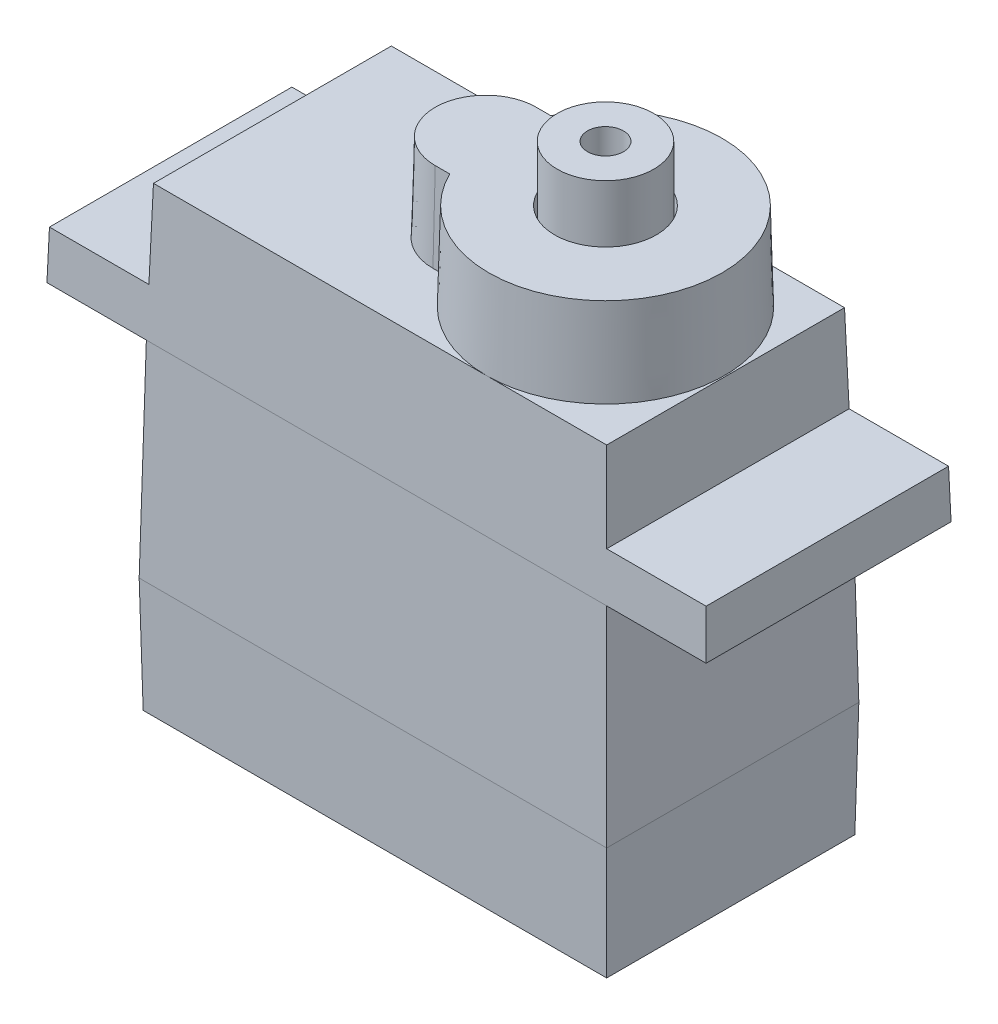
ISO-10303-21;
HEADER;
FILE_DESCRIPTION(('STEP AP214'),'2;1');
FILE_NAME('part.step','',(''),(''),'','','');
FILE_SCHEMA(('AUTOMOTIVE_DESIGN { 1 0 10303 214 1 1 1 1 }'));
ENDSEC;
DATA;
#1=APPLICATION_CONTEXT('core data for automotive mechanical design processes');
#2=APPLICATION_PROTOCOL_DEFINITION('international standard','automotive_design',2000,#1);
#3=PRODUCT_CONTEXT('',#1,'mechanical');
#4=PRODUCT('Part','Part','',(#3));
#5=PRODUCT_RELATED_PRODUCT_CATEGORY('part','',(#4));
#6=PRODUCT_DEFINITION_FORMATION('','',#4);
#7=PRODUCT_DEFINITION_CONTEXT('part definition',#1,'design');
#8=PRODUCT_DEFINITION('design','',#6,#7);
#9=PRODUCT_DEFINITION_SHAPE('','',#8);
#10=(LENGTH_UNIT() NAMED_UNIT(*) SI_UNIT(.MILLI.,.METRE.));
#11=(NAMED_UNIT(*) PLANE_ANGLE_UNIT() SI_UNIT($,.RADIAN.));
#12=(NAMED_UNIT(*) SI_UNIT($,.STERADIAN.) SOLID_ANGLE_UNIT());
#13=UNCERTAINTY_MEASURE_WITH_UNIT(LENGTH_MEASURE(1.E-05),#10,'distance_accuracy_value','');
#14=(GEOMETRIC_REPRESENTATION_CONTEXT(3) GLOBAL_UNCERTAINTY_ASSIGNED_CONTEXT((#13)) GLOBAL_UNIT_ASSIGNED_CONTEXT((#10,
#11,#12)) REPRESENTATION_CONTEXT('',''));
#15=CARTESIAN_POINT('',(0.,0.,0.));
#16=DIRECTION('',(0.,0.,1.));
#17=DIRECTION('',(1.,0.,0.));
#18=AXIS2_PLACEMENT_3D('',#15,#16,#17);
#19=CARTESIAN_POINT('',(0.,11.0236,0.));
#20=DIRECTION('',(0.,1.,0.));
#21=DIRECTION('',(0.,0.,1.));
#22=AXIS2_PLACEMENT_3D('',#19,#20,#21);
#23=PLANE('',#22);
#24=CARTESIAN_POINT('',(5.25,11.0236,0.));
#25=DIRECTION('',(0.,1.,0.));
#26=DIRECTION('',(0.,0.,1.));
#27=AXIS2_PLACEMENT_3D('',#24,#25,#26);
#28=CIRCLE('',#27,2.50825);
#29=CARTESIAN_POINT('',(5.25,11.0236,2.50825));
#30=VERTEX_POINT('',#29);
#31=EDGE_CURVE('E723',#30,#30,#28,.T.);
#32=ORIENTED_EDGE('',*,*,#31,.F.);
#33=EDGE_LOOP('',(#32));
#34=FACE_BOUND('',#33,.T.);
#35=DIRECTION('',(1.,0.,0.));
#36=VECTOR('',#35,1.);
#37=CARTESIAN_POINT('',(-0.652959754470408,11.0236,-2.49009662946031));
#38=LINE('',#37,#36);
#39=CARTESIAN_POINT('',(0.0669441568456282,11.0236,-2.49009662946031));
#40=VERTEX_POINT('',#39);
#41=CARTESIAN_POINT('',(-0.652959754470408,11.0236,-2.49009662946031));
#42=VERTEX_POINT('',#41);
#43=EDGE_CURVE('E179',#40,#42,#38,.F.);
#44=ORIENTED_EDGE('',*,*,#43,.T.);
#45=CARTESIAN_POINT('',(-0.652959754470408,11.0236,0.));
#46=DIRECTION('',(0.,1.,0.));
#47=DIRECTION('',(0.,0.,1.));
#48=AXIS2_PLACEMENT_3D('',#45,#46,#47);
#49=CIRCLE('',#48,2.49009662946031);
#50=CARTESIAN_POINT('',(-0.652959754470408,11.0236,2.49009662946031));
#51=VERTEX_POINT('',#50);
#52=EDGE_CURVE('E185',#42,#51,#49,.T.);
#53=ORIENTED_EDGE('',*,*,#52,.T.);
#54=DIRECTION('',(-1.,0.,0.));
#55=VECTOR('',#54,1.);
#56=CARTESIAN_POINT('',(-0.652959754470408,11.0236,2.49009662946031));
#57=LINE('',#56,#55);
#58=CARTESIAN_POINT('',(0.0669441568456274,11.0236,2.49009662946031));
#59=VERTEX_POINT('',#58);
#60=EDGE_CURVE('E188',#51,#59,#57,.F.);
#61=ORIENTED_EDGE('',*,*,#60,.T.);
#62=CARTESIAN_POINT('',(5.25,11.0236,0.));
#63=DIRECTION('',(0.,1.,0.));
#64=DIRECTION('',(0.,0.,1.));
#65=AXIS2_PLACEMENT_3D('',#62,#63,#64);
#66=CIRCLE('',#65,5.75018687498991);
#67=EDGE_CURVE('E173',#59,#40,#66,.T.);
#68=ORIENTED_EDGE('',*,*,#67,.T.);
#69=EDGE_LOOP('',(#44,#53,#61,#68));
#70=FACE_BOUND('',#69,.T.);
#71=ADVANCED_FACE('F37',(#34,#70),#23,.T.);
#72=CARTESIAN_POINT('',(0.,6.6929,0.));
#73=DIRECTION('',(0.,1.,0.));
#74=DIRECTION('',(0.,0.,1.));
#75=AXIS2_PLACEMENT_3D('',#72,#73,#74);
#76=PLANE('',#75);
#77=CARTESIAN_POINT('',(5.25,6.6929,0.));
#78=DIRECTION('',(0.,1.,0.));
#79=DIRECTION('',(0.,0.,1.));
#80=AXIS2_PLACEMENT_3D('',#77,#78,#79);
#81=CIRCLE('',#80,5.86359024552959);
#82=CARTESIAN_POINT('',(5.25,6.6929,-5.86359024552959));
#83=VERTEX_POINT('',#82);
#84=CARTESIAN_POINT('',(-0.0039012474036702,6.6929,-2.60349999999999));
#85=VERTEX_POINT('',#84);
#86=EDGE_CURVE('E12',#83,#85,#81,.T.);
#87=ORIENTED_EDGE('',*,*,#86,.F.);
#88=DIRECTION('',(1.,0.,0.));
#89=VECTOR('',#88,1.);
#90=CARTESIAN_POINT('',(0.,6.6929,-5.86359024552959));
#91=LINE('',#90,#89);
#92=CARTESIAN_POINT('',(-11.1721902455296,6.6929,-5.86359024552959));
#93=VERTEX_POINT('',#92);
#94=EDGE_CURVE('E443',#83,#93,#91,.F.);
#95=ORIENTED_EDGE('',*,*,#94,.T.);
#96=DIRECTION('',(0.,0.,-1.));
#97=VECTOR('',#96,1.);
#98=CARTESIAN_POINT('',(-11.1721902455296,6.6929,0.));
#99=LINE('',#98,#97);
#100=CARTESIAN_POINT('',(-11.1721902455296,6.6929,5.86359024552959));
#101=VERTEX_POINT('',#100);
#102=EDGE_CURVE('E437',#93,#101,#99,.F.);
#103=ORIENTED_EDGE('',*,*,#102,.T.);
#104=DIRECTION('',(-1.,0.,0.));
#105=VECTOR('',#104,1.);
#106=CARTESIAN_POINT('',(0.,6.6929,5.86359024552959));
#107=LINE('',#106,#105);
#108=CARTESIAN_POINT('',(5.25,6.6929,5.86359024552959));
#109=VERTEX_POINT('',#108);
#110=EDGE_CURVE('E382',#101,#109,#107,.F.);
#111=ORIENTED_EDGE('',*,*,#110,.T.);
#112=CARTESIAN_POINT('',(-0.00390124740367107,6.6929,2.60349999999999));
#113=VERTEX_POINT('',#112);
#114=EDGE_CURVE('E48',#113,#109,#81,.T.);
#115=ORIENTED_EDGE('',*,*,#114,.F.);
#116=DIRECTION('',(1.,0.,0.));
#117=VECTOR('',#116,1.);
#118=CARTESIAN_POINT('',(-0.652959754470408,6.6929,2.60349999999999));
#119=LINE('',#118,#117);
#120=CARTESIAN_POINT('',(-0.652959754470408,6.6929,2.60349999999999));
#121=VERTEX_POINT('',#120);
#122=EDGE_CURVE('E202',#121,#113,#119,.T.);
#123=ORIENTED_EDGE('',*,*,#122,.F.);
#124=CARTESIAN_POINT('',(-0.652959754470408,6.6929,0.));
#125=DIRECTION('',(0.,1.,0.));
#126=DIRECTION('',(0.,0.,1.));
#127=AXIS2_PLACEMENT_3D('',#124,#125,#126);
#128=CIRCLE('',#127,2.60349999999999);
#129=CARTESIAN_POINT('',(-0.652959754470408,6.6929,-2.60349999999999));
#130=VERTEX_POINT('',#129);
#131=EDGE_CURVE('E59',#130,#121,#128,.T.);
#132=ORIENTED_EDGE('',*,*,#131,.F.);
#133=DIRECTION('',(-1.,0.,0.));
#134=VECTOR('',#133,1.);
#135=CARTESIAN_POINT('',(-0.652959754470408,6.6929,-2.60349999999999));
#136=LINE('',#135,#134);
#137=EDGE_CURVE('E55',#85,#130,#136,.T.);
#138=ORIENTED_EDGE('',*,*,#137,.F.);
#139=EDGE_LOOP('',(#87,#95,#103,#111,#115,#123,#132,#138));
#140=FACE_BOUND('',#139,.T.);
#141=ADVANCED_FACE('F252',(#140),#76,.T.);
#142=CARTESIAN_POINT('',(0.,0.,0.));
#143=DIRECTION('',(0.,1.,0.));
#144=DIRECTION('',(0.,0.,1.));
#145=AXIS2_PLACEMENT_3D('',#142,#143,#144);
#146=PLANE('',#145);
#147=DIRECTION('',(0.,0.,1.));
#148=VECTOR('',#147,1.);
#149=CARTESIAN_POINT('',(11.34745,0.,-6.03885));
#150=LINE('',#149,#148);
#151=CARTESIAN_POINT('',(11.34745,0.,-6.03885));
#152=VERTEX_POINT('',#151);
#153=CARTESIAN_POINT('',(11.34745,0.,6.03885));
#154=VERTEX_POINT('',#153);
#155=EDGE_CURVE('E473',#152,#154,#150,.T.);
#156=ORIENTED_EDGE('',*,*,#155,.F.);
#157=DIRECTION('',(1.,0.,0.));
#158=VECTOR('',#157,1.);
#159=CARTESIAN_POINT('',(0.,0.,-6.03885));
#160=LINE('',#159,#158);
#161=CARTESIAN_POINT('',(16.25,0.,-6.03885));
#162=VERTEX_POINT('',#161);
#163=EDGE_CURVE('E367',#162,#152,#160,.F.);
#164=ORIENTED_EDGE('',*,*,#163,.F.);
#165=DIRECTION('',(0.,0.,1.));
#166=VECTOR('',#165,1.);
#167=CARTESIAN_POINT('',(16.25,0.,0.));
#168=LINE('',#167,#166);
#169=CARTESIAN_POINT('',(16.25,0.,6.03885));
#170=VERTEX_POINT('',#169);
#171=EDGE_CURVE('E384',#170,#162,#168,.F.);
#172=ORIENTED_EDGE('',*,*,#171,.F.);
#173=DIRECTION('',(-1.,0.,0.));
#174=VECTOR('',#173,1.);
#175=CARTESIAN_POINT('',(0.,0.,6.03885));
#176=LINE('',#175,#174);
#177=EDGE_CURVE('E347',#154,#170,#176,.F.);
#178=ORIENTED_EDGE('',*,*,#177,.F.);
#179=EDGE_LOOP('',(#156,#164,#172,#178));
#180=FACE_BOUND('',#179,.T.);
#181=ADVANCED_FACE('F258',(#180),#146,.F.);
#182=DIRECTION('',(0.,0.,-1.));
#183=VECTOR('',#182,1.);
#184=CARTESIAN_POINT('',(-11.34745,0.,6.03885));
#185=LINE('',#184,#183);
#186=CARTESIAN_POINT('',(-11.34745,0.,6.03885));
#187=VERTEX_POINT('',#186);
#188=CARTESIAN_POINT('',(-11.34745,0.,-6.03885));
#189=VERTEX_POINT('',#188);
#190=EDGE_CURVE('E394',#187,#189,#185,.T.);
#191=ORIENTED_EDGE('',*,*,#190,.F.);
#192=CARTESIAN_POINT('',(-16.25,0.,6.03885));
#193=VERTEX_POINT('',#192);
#194=EDGE_CURVE('E350',#193,#187,#176,.F.);
#195=ORIENTED_EDGE('',*,*,#194,.F.);
#196=DIRECTION('',(0.,0.,-1.));
#197=VECTOR('',#196,1.);
#198=CARTESIAN_POINT('',(-16.25,0.,0.));
#199=LINE('',#198,#197);
#200=CARTESIAN_POINT('',(-16.25,0.,-6.03885));
#201=VERTEX_POINT('',#200);
#202=EDGE_CURVE('E339',#201,#193,#199,.F.);
#203=ORIENTED_EDGE('',*,*,#202,.F.);
#204=EDGE_CURVE('E378',#189,#201,#160,.F.);
#205=ORIENTED_EDGE('',*,*,#204,.F.);
#206=EDGE_LOOP('',(#191,#195,#203,#205));
#207=FACE_BOUND('',#206,.T.);
#208=ADVANCED_FACE('F312',(#207),#146,.F.);
#209=CARTESIAN_POINT('',(0.,2.3749,0.));
#210=DIRECTION('',(0.,1.,0.));
#211=DIRECTION('',(0.,0.,1.));
#212=AXIS2_PLACEMENT_3D('',#209,#210,#211);
#213=PLANE('',#212);
#214=DIRECTION('',(0.,0.,-1.));
#215=VECTOR('',#214,1.);
#216=CARTESIAN_POINT('',(-11.2852610548653,2.3749,0.));
#217=LINE('',#216,#215);
#218=CARTESIAN_POINT('',(-11.2852610548653,2.3749,-5.97666105486534));
#219=VERTEX_POINT('',#218);
#220=CARTESIAN_POINT('',(-11.2852610548653,2.3749,5.97666105486534));
#221=VERTEX_POINT('',#220);
#222=EDGE_CURVE('E370',#219,#221,#217,.F.);
#223=ORIENTED_EDGE('',*,*,#222,.F.);
#224=DIRECTION('',(1.,0.,0.));
#225=VECTOR('',#224,1.);
#226=CARTESIAN_POINT('',(0.,2.3749,-5.97666105486534));
#227=LINE('',#226,#225);
#228=CARTESIAN_POINT('',(-16.1878110548653,2.3749,-5.97666105486534));
#229=VERTEX_POINT('',#228);
#230=EDGE_CURVE('E359',#219,#229,#227,.F.);
#231=ORIENTED_EDGE('',*,*,#230,.T.);
#232=DIRECTION('',(0.,0.,-1.));
#233=VECTOR('',#232,1.);
#234=CARTESIAN_POINT('',(-16.1878110548653,2.3749,0.));
#235=LINE('',#234,#233);
#236=CARTESIAN_POINT('',(-16.1878110548653,2.3749,5.97666105486534));
#237=VERTEX_POINT('',#236);
#238=EDGE_CURVE('E363',#229,#237,#235,.F.);
#239=ORIENTED_EDGE('',*,*,#238,.T.);
#240=DIRECTION('',(-1.,0.,0.));
#241=VECTOR('',#240,1.);
#242=CARTESIAN_POINT('',(0.,2.3749,5.97666105486534));
#243=LINE('',#242,#241);
#244=EDGE_CURVE('E368',#237,#221,#243,.F.);
#245=ORIENTED_EDGE('',*,*,#244,.T.);
#246=EDGE_LOOP('',(#223,#231,#239,#245));
#247=FACE_BOUND('',#246,.T.);
#248=ADVANCED_FACE('F309',(#247),#213,.T.);
#249=CARTESIAN_POINT('',(-16.25,0.,0.));
#250=DIRECTION('',(-0.999657324975557,0.0261769483078732,0.));
#251=DIRECTION('',(-0.0261769483078732,-0.999657324975557,0.));
#252=AXIS2_PLACEMENT_3D('',#249,#250,#251);
#253=PLANE('',#252);
#254=ORIENTED_EDGE('',*,*,#202,.T.);
#255=DIRECTION('',(-0.0261679842649794,-0.99931500198837,0.0261679842649794));
#256=VECTOR('',#255,1.);
#257=CARTESIAN_POINT('',(-16.238872594742,0.42493846277658,6.027722594742));
#258=LINE('',#257,#256);
#259=EDGE_CURVE('E342',#237,#193,#258,.T.);
#260=ORIENTED_EDGE('',*,*,#259,.F.);
#261=ORIENTED_EDGE('',*,*,#238,.F.);
#262=DIRECTION('',(-0.0261679842649794,-0.99931500198837,-0.0261679842649794));
#263=VECTOR('',#262,1.);
#264=CARTESIAN_POINT('',(-16.2458648165389,0.157916285288514,-6.03471481653894));
#265=LINE('',#264,#263);
#266=EDGE_CURVE('E344',#229,#201,#265,.T.);
#267=ORIENTED_EDGE('',*,*,#266,.T.);
#268=EDGE_LOOP('',(#254,#260,#261,#267));
#269=FACE_BOUND('',#268,.T.);
#270=ADVANCED_FACE('F326',(#269),#253,.T.);
#271=CARTESIAN_POINT('',(0.,0.,6.03885));
#272=DIRECTION('',(0.,0.0261769483078732,0.999657324975557));
#273=DIRECTION('',(0.,-0.999657324975557,0.0261769483078732));
#274=AXIS2_PLACEMENT_3D('',#271,#272,#273);
#275=PLANE('',#274);
#276=ORIENTED_EDGE('',*,*,#194,.T.);
#277=DIRECTION('',(-1.,0.,0.));
#278=VECTOR('',#277,1.);
#279=CARTESIAN_POINT('',(11.34745,0.,6.03885));
#280=LINE('',#279,#278);
#281=EDGE_CURVE('E399',#154,#187,#280,.T.);
#282=ORIENTED_EDGE('',*,*,#281,.F.);
#283=ORIENTED_EDGE('',*,*,#177,.T.);
#284=DIRECTION('',(0.0261679842649794,-0.99931500198837,0.0261679842649794));
#285=VECTOR('',#284,1.);
#286=CARTESIAN_POINT('',(16.2458648165389,0.157916285288514,6.03471481653894));
#287=LINE('',#286,#285);
#288=CARTESIAN_POINT('',(16.1878110548653,2.3749,5.97666105486534));
#289=VERTEX_POINT('',#288);
#290=EDGE_CURVE('E432',#289,#170,#287,.T.);
#291=ORIENTED_EDGE('',*,*,#290,.F.);
#292=DIRECTION('',(-1.,0.,0.));
#293=VECTOR('',#292,1.);
#294=CARTESIAN_POINT('',(0.,2.3749,5.97666105486534));
#295=LINE('',#294,#293);
#296=CARTESIAN_POINT('',(11.2852610548653,2.3749,5.97666105486534));
#297=VERTEX_POINT('',#296);
#298=EDGE_CURVE('E366',#297,#289,#295,.F.);
#299=ORIENTED_EDGE('',*,*,#298,.F.);
#300=DIRECTION('',(0.0261679842649794,-0.99931500198837,0.0261679842649794));
#301=VECTOR('',#300,1.);
#302=CARTESIAN_POINT('',(11.3433148165389,0.157916285288514,6.03471481653894));
#303=LINE('',#302,#301);
#304=CARTESIAN_POINT('',(11.1721902455296,6.6929,5.86359024552959));
#305=VERTEX_POINT('',#304);
#306=EDGE_CURVE('E353',#305,#297,#303,.T.);
#307=ORIENTED_EDGE('',*,*,#306,.F.);
#308=EDGE_CURVE('E446',#109,#305,#107,.F.);
#309=ORIENTED_EDGE('',*,*,#308,.F.);
#310=ORIENTED_EDGE('',*,*,#110,.F.);
#311=DIRECTION('',(-0.0261679842649794,-0.99931500198837,0.0261679842649794));
#312=VECTOR('',#311,1.);
#313=CARTESIAN_POINT('',(-11.3396796815511,0.296736489811329,6.03107968155109));
#314=LINE('',#313,#312);
#315=EDGE_CURVE('E348',#101,#221,#314,.T.);
#316=ORIENTED_EDGE('',*,*,#315,.T.);
#317=ORIENTED_EDGE('',*,*,#244,.F.);
#318=ORIENTED_EDGE('',*,*,#259,.T.);
#319=EDGE_LOOP('',(#276,#282,#283,#291,#299,#307,#309,#310,#316,#317,#318));
#320=FACE_BOUND('',#319,.T.);
#321=ADVANCED_FACE('F39',(#320),#275,.T.);
#322=CARTESIAN_POINT('',(16.25,0.,0.));
#323=DIRECTION('',(0.999657324975557,0.0261769483078732,0.));
#324=DIRECTION('',(-0.0261769483078732,0.999657324975557,0.));
#325=AXIS2_PLACEMENT_3D('',#322,#323,#324);
#326=PLANE('',#325);
#327=ORIENTED_EDGE('',*,*,#171,.T.);
#328=DIRECTION('',(0.0261679842649794,-0.99931500198837,-0.0261679842649794));
#329=VECTOR('',#328,1.);
#330=CARTESIAN_POINT('',(16.238872594742,0.42493846277658,-6.027722594742));
#331=LINE('',#330,#329);
#332=CARTESIAN_POINT('',(16.1878110548653,2.3749,-5.97666105486534));
#333=VERTEX_POINT('',#332);
#334=EDGE_CURVE('E427',#333,#162,#331,.T.);
#335=ORIENTED_EDGE('',*,*,#334,.F.);
#336=DIRECTION('',(0.,0.,1.));
#337=VECTOR('',#336,1.);
#338=CARTESIAN_POINT('',(16.1878110548653,2.3749,0.));
#339=LINE('',#338,#337);
#340=EDGE_CURVE('E362',#289,#333,#339,.F.);
#341=ORIENTED_EDGE('',*,*,#340,.F.);
#342=ORIENTED_EDGE('',*,*,#290,.T.);
#343=EDGE_LOOP('',(#327,#335,#341,#342));
#344=FACE_BOUND('',#343,.T.);
#345=ADVANCED_FACE('F317',(#344),#326,.T.);
#346=CARTESIAN_POINT('',(0.,0.,-6.03885));
#347=DIRECTION('',(0.,0.0261769483078732,-0.999657324975557));
#348=DIRECTION('',(0.,0.999657324975557,0.0261769483078732));
#349=AXIS2_PLACEMENT_3D('',#346,#347,#348);
#350=PLANE('',#349);
#351=ORIENTED_EDGE('',*,*,#163,.T.);
#352=DIRECTION('',(1.,0.,0.));
#353=VECTOR('',#352,1.);
#354=CARTESIAN_POINT('',(-11.34745,0.,-6.03885));
#355=LINE('',#354,#353);
#356=EDGE_CURVE('E398',#189,#152,#355,.T.);
#357=ORIENTED_EDGE('',*,*,#356,.F.);
#358=ORIENTED_EDGE('',*,*,#204,.T.);
#359=ORIENTED_EDGE('',*,*,#266,.F.);
#360=ORIENTED_EDGE('',*,*,#230,.F.);
#361=DIRECTION('',(-0.0261679842649794,-0.99931500198837,-0.0261679842649794));
#362=VECTOR('',#361,1.);
#363=CARTESIAN_POINT('',(-11.3433148165389,0.157916285288514,-6.03471481653894));
#364=LINE('',#363,#362);
#365=EDGE_CURVE('E423',#93,#219,#364,.T.);
#366=ORIENTED_EDGE('',*,*,#365,.F.);
#367=ORIENTED_EDGE('',*,*,#94,.F.);
#368=CARTESIAN_POINT('',(11.1721902455296,6.6929,-5.86359024552959));
#369=VERTEX_POINT('',#368);
#370=EDGE_CURVE('E430',#369,#83,#91,.F.);
#371=ORIENTED_EDGE('',*,*,#370,.F.);
#372=DIRECTION('',(0.0261679842649794,-0.99931500198837,-0.0261679842649794));
#373=VECTOR('',#372,1.);
#374=CARTESIAN_POINT('',(11.3396796815511,0.296736489811329,-6.03107968155109));
#375=LINE('',#374,#373);
#376=CARTESIAN_POINT('',(11.2852610548653,2.3749,-5.97666105486534));
#377=VERTEX_POINT('',#376);
#378=EDGE_CURVE('E420',#369,#377,#375,.T.);
#379=ORIENTED_EDGE('',*,*,#378,.T.);
#380=DIRECTION('',(1.,0.,0.));
#381=VECTOR('',#380,1.);
#382=CARTESIAN_POINT('',(0.,2.3749,-5.97666105486534));
#383=LINE('',#382,#381);
#384=EDGE_CURVE('E361',#333,#377,#383,.F.);
#385=ORIENTED_EDGE('',*,*,#384,.F.);
#386=ORIENTED_EDGE('',*,*,#334,.T.);
#387=EDGE_LOOP('',(#351,#357,#358,#359,#360,#366,#367,#371,#379,#385,#386));
#388=FACE_BOUND('',#387,.T.);
#389=ADVANCED_FACE('F307',(#388),#350,.T.);
#390=DIRECTION('',(0.,0.,1.));
#391=VECTOR('',#390,1.);
#392=CARTESIAN_POINT('',(11.2852610548653,2.3749,0.));
#393=LINE('',#392,#391);
#394=EDGE_CURVE('E373',#297,#377,#393,.F.);
#395=ORIENTED_EDGE('',*,*,#394,.F.);
#396=ORIENTED_EDGE('',*,*,#298,.T.);
#397=ORIENTED_EDGE('',*,*,#340,.T.);
#398=ORIENTED_EDGE('',*,*,#384,.T.);
#399=EDGE_LOOP('',(#395,#396,#397,#398));
#400=FACE_BOUND('',#399,.T.);
#401=ADVANCED_FACE('F303',(#400),#213,.T.);
#402=CARTESIAN_POINT('',(-11.34745,0.,0.));
#403=DIRECTION('',(-0.999657324975557,0.0261769483078732,0.));
#404=DIRECTION('',(-0.0261769483078732,-0.999657324975557,0.));
#405=AXIS2_PLACEMENT_3D('',#402,#403,#404);
#406=PLANE('',#405);
#407=ORIENTED_EDGE('',*,*,#222,.T.);
#408=ORIENTED_EDGE('',*,*,#315,.F.);
#409=ORIENTED_EDGE('',*,*,#102,.F.);
#410=ORIENTED_EDGE('',*,*,#365,.T.);
#411=EDGE_LOOP('',(#407,#408,#409,#410));
#412=FACE_BOUND('',#411,.T.);
#413=ADVANCED_FACE('F306',(#412),#406,.T.);
#414=CARTESIAN_POINT('',(11.34745,0.,0.));
#415=DIRECTION('',(0.999657324975557,0.0261769483078732,0.));
#416=DIRECTION('',(-0.0261769483078732,0.999657324975557,0.));
#417=AXIS2_PLACEMENT_3D('',#414,#415,#416);
#418=PLANE('',#417);
#419=ORIENTED_EDGE('',*,*,#394,.T.);
#420=ORIENTED_EDGE('',*,*,#378,.F.);
#421=DIRECTION('',(0.,0.,1.));
#422=VECTOR('',#421,1.);
#423=CARTESIAN_POINT('',(11.1721902455296,6.6929,0.));
#424=LINE('',#423,#422);
#425=EDGE_CURVE('E441',#305,#369,#424,.F.);
#426=ORIENTED_EDGE('',*,*,#425,.F.);
#427=ORIENTED_EDGE('',*,*,#306,.T.);
#428=EDGE_LOOP('',(#419,#420,#426,#427));
#429=FACE_BOUND('',#428,.T.);
#430=ADVANCED_FACE('F301',(#429),#418,.T.);
#431=EDGE_CURVE('E46',#109,#83,#81,.T.);
#432=ORIENTED_EDGE('',*,*,#431,.F.);
#433=ORIENTED_EDGE('',*,*,#308,.T.);
#434=ORIENTED_EDGE('',*,*,#425,.T.);
#435=ORIENTED_EDGE('',*,*,#370,.T.);
#436=EDGE_LOOP('',(#432,#433,#434,#435));
#437=FACE_BOUND('',#436,.T.);
#438=ADVANCED_FACE('F260',(#437),#76,.T.);
#439=CARTESIAN_POINT('',(11.34745,0.,-6.03885));
#440=DIRECTION('',(0.999847695156391,0.0174524064372835,0.));
#441=DIRECTION('',(-0.0174524064372835,0.999847695156391,0.));
#442=AXIS2_PLACEMENT_3D('',#439,#440,#441);
#443=PLANE('',#442);
#444=ORIENTED_EDGE('',*,*,#155,.T.);
#445=DIRECTION('',(-0.0174497491606827,0.999695459881887,-0.0174497491606827));
#446=VECTOR('',#445,1.);
#447=CARTESIAN_POINT('',(11.34745,0.,6.03885));
#448=LINE('',#447,#446);
#449=CARTESIAN_POINT('',(11.5247934596707,-10.16,6.21619345967069));
#450=VERTEX_POINT('',#449);
#451=EDGE_CURVE('E374',#450,#154,#448,.T.);
#452=ORIENTED_EDGE('',*,*,#451,.F.);
#453=DIRECTION('',(0.,0.,-1.));
#454=VECTOR('',#453,1.);
#455=CARTESIAN_POINT('',(11.5247934596707,-10.16,-6.03885));
#456=LINE('',#455,#454);
#457=CARTESIAN_POINT('',(11.5247934596707,-10.16,-6.21619345967069));
#458=VERTEX_POINT('',#457);
#459=EDGE_CURVE('E407',#458,#450,#456,.F.);
#460=ORIENTED_EDGE('',*,*,#459,.F.);
#461=DIRECTION('',(-0.0174497491606827,0.999695459881887,0.0174497491606827));
#462=VECTOR('',#461,1.);
#463=CARTESIAN_POINT('',(11.34745,0.,-6.03885));
#464=LINE('',#463,#462);
#465=EDGE_CURVE('E419',#458,#152,#464,.T.);
#466=ORIENTED_EDGE('',*,*,#465,.T.);
#467=EDGE_LOOP('',(#444,#452,#460,#466));
#468=FACE_BOUND('',#467,.T.);
#469=ADVANCED_FACE('F285',(#468),#443,.T.);
#470=CARTESIAN_POINT('',(11.34745,0.,6.03885));
#471=DIRECTION('',(0.,0.0174524064372835,0.999847695156391));
#472=DIRECTION('',(0.,-0.999847695156391,0.0174524064372835));
#473=AXIS2_PLACEMENT_3D('',#470,#471,#472);
#474=PLANE('',#473);
#475=ORIENTED_EDGE('',*,*,#281,.T.);
#476=DIRECTION('',(0.0174497491606827,0.999695459881887,-0.0174497491606827));
#477=VECTOR('',#476,1.);
#478=CARTESIAN_POINT('',(-11.34745,0.,6.03885));
#479=LINE('',#478,#477);
#480=CARTESIAN_POINT('',(-11.5247934596707,-10.16,6.21619345967069));
#481=VERTEX_POINT('',#480);
#482=EDGE_CURVE('E491',#481,#187,#479,.T.);
#483=ORIENTED_EDGE('',*,*,#482,.F.);
#484=DIRECTION('',(1.,0.,0.));
#485=VECTOR('',#484,1.);
#486=CARTESIAN_POINT('',(11.34745,-10.16,6.21619345967069));
#487=LINE('',#486,#485);
#488=EDGE_CURVE('E410',#450,#481,#487,.F.);
#489=ORIENTED_EDGE('',*,*,#488,.F.);
#490=ORIENTED_EDGE('',*,*,#451,.T.);
#491=EDGE_LOOP('',(#475,#483,#489,#490));
#492=FACE_BOUND('',#491,.T.);
#493=ADVANCED_FACE('F288',(#492),#474,.T.);
#494=CARTESIAN_POINT('',(-11.34745,0.,6.03885));
#495=DIRECTION('',(-0.999847695156391,0.0174524064372835,0.));
#496=DIRECTION('',(-0.0174524064372835,-0.999847695156391,0.));
#497=AXIS2_PLACEMENT_3D('',#494,#495,#496);
#498=PLANE('',#497);
#499=ORIENTED_EDGE('',*,*,#190,.T.);
#500=DIRECTION('',(0.0174497491606827,0.999695459881887,0.0174497491606827));
#501=VECTOR('',#500,1.);
#502=CARTESIAN_POINT('',(-11.34745,0.,-6.03885));
#503=LINE('',#502,#501);
#504=CARTESIAN_POINT('',(-11.5247934596707,-10.16,-6.21619345967069));
#505=VERTEX_POINT('',#504);
#506=EDGE_CURVE('E400',#505,#189,#503,.T.);
#507=ORIENTED_EDGE('',*,*,#506,.F.);
#508=DIRECTION('',(0.,0.,1.));
#509=VECTOR('',#508,1.);
#510=CARTESIAN_POINT('',(-11.5247934596707,-10.16,6.03885));
#511=LINE('',#510,#509);
#512=EDGE_CURVE('E413',#481,#505,#511,.F.);
#513=ORIENTED_EDGE('',*,*,#512,.F.);
#514=ORIENTED_EDGE('',*,*,#482,.T.);
#515=EDGE_LOOP('',(#499,#507,#513,#514));
#516=FACE_BOUND('',#515,.T.);
#517=ADVANCED_FACE('F292',(#516),#498,.T.);
#518=CARTESIAN_POINT('',(-11.34745,0.,-6.03885));
#519=DIRECTION('',(0.,0.0174524064372835,-0.999847695156391));
#520=DIRECTION('',(0.,0.999847695156391,0.0174524064372835));
#521=AXIS2_PLACEMENT_3D('',#518,#519,#520);
#522=PLANE('',#521);
#523=ORIENTED_EDGE('',*,*,#356,.T.);
#524=ORIENTED_EDGE('',*,*,#465,.F.);
#525=DIRECTION('',(-1.,0.,0.));
#526=VECTOR('',#525,1.);
#527=CARTESIAN_POINT('',(-11.34745,-10.16,-6.21619345967069));
#528=LINE('',#527,#526);
#529=EDGE_CURVE('E416',#505,#458,#528,.F.);
#530=ORIENTED_EDGE('',*,*,#529,.F.);
#531=ORIENTED_EDGE('',*,*,#506,.T.);
#532=EDGE_LOOP('',(#523,#524,#530,#531));
#533=FACE_BOUND('',#532,.T.);
#534=ADVANCED_FACE('F277',(#533),#522,.T.);
#535=CARTESIAN_POINT('',(-11.5247934596707,-10.16,6.21619345967069));
#536=DIRECTION('',(-0.999847695156391,-0.0174524064372835,0.));
#537=DIRECTION('',(0.0174524064372835,-0.999847695156391,0.));
#538=AXIS2_PLACEMENT_3D('',#535,#536,#537);
#539=PLANE('',#538);
#540=DIRECTION('',(-0.0174497491606827,0.999695459881887,-0.0174497491606827));
#541=VECTOR('',#540,1.);
#542=CARTESIAN_POINT('',(-11.5247934596707,-10.16,-6.21619345967069));
#543=LINE('',#542,#541);
#544=CARTESIAN_POINT('',(-11.4261461602289,-15.8115,-6.11754616022887));
#545=VERTEX_POINT('',#544);
#546=EDGE_CURVE('E189',#545,#505,#543,.T.);
#547=ORIENTED_EDGE('',*,*,#546,.F.);
#548=DIRECTION('',(0.,0.,-1.));
#549=VECTOR('',#548,1.);
#550=CARTESIAN_POINT('',(-11.4261461602289,-15.8115,6.21619345967069));
#551=LINE('',#550,#549);
#552=CARTESIAN_POINT('',(-11.4261461602289,-15.8115,6.11754616022887));
#553=VERTEX_POINT('',#552);
#554=EDGE_CURVE('E467',#545,#553,#551,.F.);
#555=ORIENTED_EDGE('',*,*,#554,.T.);
#556=DIRECTION('',(-0.0174497491606827,0.999695459881887,0.0174497491606827));
#557=VECTOR('',#556,1.);
#558=CARTESIAN_POINT('',(-11.5247934596707,-10.16,6.21619345967069));
#559=LINE('',#558,#557);
#560=EDGE_CURVE('E192',#553,#481,#559,.T.);
#561=ORIENTED_EDGE('',*,*,#560,.T.);
#562=ORIENTED_EDGE('',*,*,#512,.T.);
#563=EDGE_LOOP('',(#547,#555,#561,#562));
#564=FACE_BOUND('',#563,.T.);
#565=ADVANCED_FACE('F273',(#564),#539,.T.);
#566=CARTESIAN_POINT('',(11.5247934596707,-10.16,6.21619345967069));
#567=DIRECTION('',(0.,-0.0174524064372835,0.999847695156391));
#568=DIRECTION('',(0.,-0.999847695156391,-0.0174524064372835));
#569=AXIS2_PLACEMENT_3D('',#566,#567,#568);
#570=PLANE('',#569);
#571=ORIENTED_EDGE('',*,*,#560,.F.);
#572=DIRECTION('',(-1.,0.,0.));
#573=VECTOR('',#572,1.);
#574=CARTESIAN_POINT('',(11.5247934596707,-15.8115,6.11754616022887));
#575=LINE('',#574,#573);
#576=CARTESIAN_POINT('',(11.4261461602289,-15.8115,6.11754616022887));
#577=VERTEX_POINT('',#576);
#578=EDGE_CURVE('E463',#553,#577,#575,.F.);
#579=ORIENTED_EDGE('',*,*,#578,.T.);
#580=DIRECTION('',(0.0174497491606827,0.999695459881887,0.0174497491606827));
#581=VECTOR('',#580,1.);
#582=CARTESIAN_POINT('',(11.5247934596707,-10.16,6.21619345967069));
#583=LINE('',#582,#581);
#584=EDGE_CURVE('E476',#577,#450,#583,.T.);
#585=ORIENTED_EDGE('',*,*,#584,.T.);
#586=ORIENTED_EDGE('',*,*,#488,.T.);
#587=EDGE_LOOP('',(#571,#579,#585,#586));
#588=FACE_BOUND('',#587,.T.);
#589=ADVANCED_FACE('F276',(#588),#570,.T.);
#590=CARTESIAN_POINT('',(11.5247934596707,-10.16,-6.21619345967069));
#591=DIRECTION('',(0.999847695156391,-0.0174524064372835,0.));
#592=DIRECTION('',(0.0174524064372835,0.999847695156391,0.));
#593=AXIS2_PLACEMENT_3D('',#590,#591,#592);
#594=PLANE('',#593);
#595=ORIENTED_EDGE('',*,*,#584,.F.);
#596=DIRECTION('',(0.,0.,1.));
#597=VECTOR('',#596,1.);
#598=CARTESIAN_POINT('',(11.4261461602289,-15.8115,-6.21619345967069));
#599=LINE('',#598,#597);
#600=CARTESIAN_POINT('',(11.4261461602289,-15.8115,-6.11754616022887));
#601=VERTEX_POINT('',#600);
#602=EDGE_CURVE('E466',#577,#601,#599,.F.);
#603=ORIENTED_EDGE('',*,*,#602,.T.);
#604=DIRECTION('',(0.0174497491606827,0.999695459881887,-0.0174497491606827));
#605=VECTOR('',#604,1.);
#606=CARTESIAN_POINT('',(11.5247934596707,-10.16,-6.21619345967069));
#607=LINE('',#606,#605);
#608=EDGE_CURVE('E474',#601,#458,#607,.T.);
#609=ORIENTED_EDGE('',*,*,#608,.T.);
#610=ORIENTED_EDGE('',*,*,#459,.T.);
#611=EDGE_LOOP('',(#595,#603,#609,#610));
#612=FACE_BOUND('',#611,.T.);
#613=ADVANCED_FACE('F271',(#612),#594,.T.);
#614=CARTESIAN_POINT('',(-11.5247934596707,-10.16,-6.21619345967069));
#615=DIRECTION('',(0.,-0.0174524064372835,-0.999847695156391));
#616=DIRECTION('',(0.,0.999847695156391,-0.0174524064372835));
#617=AXIS2_PLACEMENT_3D('',#614,#615,#616);
#618=PLANE('',#617);
#619=ORIENTED_EDGE('',*,*,#608,.F.);
#620=DIRECTION('',(1.,0.,0.));
#621=VECTOR('',#620,1.);
#622=CARTESIAN_POINT('',(-11.5247934596707,-15.8115,-6.11754616022887));
#623=LINE('',#622,#621);
#624=EDGE_CURVE('E470',#601,#545,#623,.F.);
#625=ORIENTED_EDGE('',*,*,#624,.T.);
#626=ORIENTED_EDGE('',*,*,#546,.T.);
#627=ORIENTED_EDGE('',*,*,#529,.T.);
#628=EDGE_LOOP('',(#619,#625,#626,#627));
#629=FACE_BOUND('',#628,.T.);
#630=ADVANCED_FACE('F267',(#629),#618,.T.);
#631=CARTESIAN_POINT('',(0.,-15.8115,0.));
#632=DIRECTION('',(0.,1.,0.));
#633=DIRECTION('',(0.,0.,1.));
#634=AXIS2_PLACEMENT_3D('',#631,#632,#633);
#635=PLANE('',#634);
#636=ORIENTED_EDGE('',*,*,#602,.F.);
#637=ORIENTED_EDGE('',*,*,#578,.F.);
#638=ORIENTED_EDGE('',*,*,#554,.F.);
#639=ORIENTED_EDGE('',*,*,#624,.F.);
#640=EDGE_LOOP('',(#636,#637,#638,#639));
#641=FACE_BOUND('',#640,.T.);
#642=ADVANCED_FACE('F264',(#641),#635,.F.);
#643=CARTESIAN_POINT('',(-0.652959754470408,6.6929,0.));
#644=DIRECTION('',(0.,-1.,0.));
#645=DIRECTION('',(0.,0.,1.));
#646=AXIS2_PLACEMENT_3D('',#643,#644,#645);
#647=CONICAL_SURFACE('',#646,2.60349999999999,0.026179938779915);
#648=ORIENTED_EDGE('',*,*,#52,.F.);
#649=DIRECTION('',(0.,-0.999657324975557,-0.0261769483078732));
#650=VECTOR('',#649,1.);
#651=CARTESIAN_POINT('',(-0.652959754470408,6.6929,-2.60349999999999));
#652=LINE('',#651,#650);
#653=EDGE_CURVE('E181',#42,#130,#652,.T.);
#654=ORIENTED_EDGE('',*,*,#653,.T.);
#655=ORIENTED_EDGE('',*,*,#131,.T.);
#656=DIRECTION('',(0.,-0.999657324975557,0.0261769483078732));
#657=VECTOR('',#656,1.);
#658=CARTESIAN_POINT('',(-0.652959754470408,6.6929,2.60349999999999));
#659=LINE('',#658,#657);
#660=EDGE_CURVE('E199',#51,#121,#659,.T.);
#661=ORIENTED_EDGE('',*,*,#660,.F.);
#662=EDGE_LOOP('',(#648,#654,#655,#661));
#663=FACE_BOUND('',#662,.T.);
#664=ADVANCED_FACE('F263',(#663),#647,.T.);
#665=CARTESIAN_POINT('',(-0.652959754470408,6.6929,2.60349999999999));
#666=DIRECTION('',(0.,0.0261769483078732,0.999657324975557));
#667=DIRECTION('',(0.,-0.999657324975557,0.0261769483078732));
#668=AXIS2_PLACEMENT_3D('',#665,#666,#667);
#669=PLANE('',#668);
#670=ORIENTED_EDGE('',*,*,#60,.F.);
#671=ORIENTED_EDGE('',*,*,#660,.T.);
#672=ORIENTED_EDGE('',*,*,#122,.T.);
#673=CARTESIAN_POINT('',(0.877871087161241,56.4066136096861,1.30170059450372));
#674=CARTESIAN_POINT('',(0.848953170146031,54.925595599457,1.34048241596214));
#675=CARTESIAN_POINT('',(0.82032199650739,53.4445720274516,1.37926438306079));
#676=CARTESIAN_POINT('',(0.763600964178508,50.4825145051569,1.45682858902302));
#677=CARTESIAN_POINT('',(0.735511105494727,49.0014805548675,1.4956108278866));
#678=CARTESIAN_POINT('',(0.596334589445406,41.5962824350204,1.68952276505721));
#679=CARTESIAN_POINT('',(0.489066516836906,35.6720462828259,1.84465434829591));
#680=CARTESIAN_POINT('',(0.281151669596828,23.8234579257492,2.1549205537199));
#681=CARTESIAN_POINT('',(0.180504895760756,17.8991057208532,2.31005517590555));
#682=CARTESIAN_POINT('',(0.0535480464019739,10.2141092116477,2.51129389175508));
#683=CARTESIAN_POINT('',(0.0247078820520599,8.45350645971372,2.55739689733172));
#684=CARTESIAN_POINT('',(-0.00390124740367107,6.6929,2.60349999999999));
#685=B_SPLINE_CURVE_WITH_KNOTS('',3,(#673,#674,#675,#676,#677,#678,#679,#680,#681,#682,#683,
#684),.UNSPECIFIED.,.F.,.F.,(4,2,2,2,2,4),(0.,4.44542358214112,8.89084721732839,
26.6725548875689,44.4542646941642,49.7385917760131),.UNSPECIFIED.);
#686=EDGE_CURVE('E203',#59,#113,#685,.T.);
#687=ORIENTED_EDGE('',*,*,#686,.F.);
#688=EDGE_LOOP('',(#670,#671,#672,#687));
#689=FACE_BOUND('',#688,.T.);
#690=ADVANCED_FACE('F216',(#689),#669,.T.);
#691=CARTESIAN_POINT('',(5.25,6.6929,0.));
#692=DIRECTION('',(0.,-1.,0.));
#693=DIRECTION('',(0.,0.,1.));
#694=AXIS2_PLACEMENT_3D('',#691,#692,#693);
#695=CONICAL_SURFACE('',#694,5.86359024552959,0.026179938779915);
#696=ORIENTED_EDGE('',*,*,#67,.F.);
#697=ORIENTED_EDGE('',*,*,#686,.T.);
#698=ORIENTED_EDGE('',*,*,#114,.T.);
#699=ORIENTED_EDGE('',*,*,#431,.T.);
#700=ORIENTED_EDGE('',*,*,#86,.T.);
#701=CARTESIAN_POINT('',(0.877871087161241,56.4066136096861,-1.30170059450372));
#702=CARTESIAN_POINT('',(0.848953170146031,54.925595599457,-1.34048241596214));
#703=CARTESIAN_POINT('',(0.820321996507389,53.4445720274516,-1.37926438306079));
#704=CARTESIAN_POINT('',(0.763600964178508,50.4825145051569,-1.45682858902302));
#705=CARTESIAN_POINT('',(0.735511105494727,49.0014805548675,-1.4956108278866));
#706=CARTESIAN_POINT('',(0.596334589445406,41.5962824350204,-1.68952276505721));
#707=CARTESIAN_POINT('',(0.489066516836906,35.6720462828259,-1.84465434829591));
#708=CARTESIAN_POINT('',(0.281151669596827,23.8234579257492,-2.1549205537199));
#709=CARTESIAN_POINT('',(0.180504895760756,17.8991057208532,-2.31005517590555));
#710=CARTESIAN_POINT('',(0.0535480464019738,10.2141092116477,-2.51129389175508));
#711=CARTESIAN_POINT('',(0.0247078820520598,8.45350645971372,-2.55739689733172));
#712=CARTESIAN_POINT('',(-0.00390124740367118,6.6929,-2.60349999999999));
#713=B_SPLINE_CURVE_WITH_KNOTS('',3,(#701,#702,#703,#704,#705,#706,#707,#708,#709,#710,#711,
#712),.UNSPECIFIED.,.F.,.F.,(4,2,2,2,2,4),(0.,4.44542358214112,8.89084721732839,
26.6725548875689,44.4542646941642,49.7385917760131),.UNSPECIFIED.);
#714=EDGE_CURVE('E168',#40,#85,#713,.T.);
#715=ORIENTED_EDGE('',*,*,#714,.F.);
#716=EDGE_LOOP('',(#696,#697,#698,#699,#700,#715));
#717=FACE_BOUND('',#716,.T.);
#718=ADVANCED_FACE('F170',(#717),#695,.T.);
#719=CARTESIAN_POINT('',(-0.652959754470408,6.6929,-2.60349999999999));
#720=DIRECTION('',(0.,0.0261769483078732,-0.999657324975557));
#721=DIRECTION('',(0.,0.999657324975557,0.0261769483078732));
#722=AXIS2_PLACEMENT_3D('',#719,#720,#721);
#723=PLANE('',#722);
#724=ORIENTED_EDGE('',*,*,#43,.F.);
#725=ORIENTED_EDGE('',*,*,#714,.T.);
#726=ORIENTED_EDGE('',*,*,#137,.T.);
#727=ORIENTED_EDGE('',*,*,#653,.F.);
#728=EDGE_LOOP('',(#724,#725,#726,#727));
#729=FACE_BOUND('',#728,.T.);
#730=ADVANCED_FACE('F180',(#729),#723,.T.);
#731=CARTESIAN_POINT('',(5.25,7.8486,0.));
#732=DIRECTION('',(0.,1.,0.));
#733=DIRECTION('',(0.,0.,1.));
#734=AXIS2_PLACEMENT_3D('',#731,#732,#733);
#735=CYLINDRICAL_SURFACE('',#734,2.50825);
#736=CARTESIAN_POINT('',(5.25,7.8486,0.));
#737=DIRECTION('',(0.,1.,0.));
#738=DIRECTION('',(0.,0.,1.));
#739=AXIS2_PLACEMENT_3D('',#736,#737,#738);
#740=CIRCLE('',#739,2.50825);
#741=CARTESIAN_POINT('',(5.25,7.8486,2.50825));
#742=VERTEX_POINT('',#741);
#743=EDGE_CURVE('E461',#742,#742,#740,.T.);
#744=ORIENTED_EDGE('',*,*,#743,.F.);
#745=EDGE_LOOP('',(#744));
#746=FACE_BOUND('',#745,.T.);
#747=ORIENTED_EDGE('',*,*,#31,.T.);
#748=EDGE_LOOP('',(#747));
#749=FACE_BOUND('',#748,.T.);
#750=ADVANCED_FACE('F225',(#746,#749),#735,.F.);
#751=CARTESIAN_POINT('',(5.25,7.8486,0.));
#752=DIRECTION('',(0.,1.,0.));
#753=DIRECTION('',(0.,0.,1.));
#754=AXIS2_PLACEMENT_3D('',#751,#752,#753);
#755=PLANE('',#754);
#756=CARTESIAN_POINT('',(5.25,7.8486,0.));
#757=DIRECTION('',(0.,1.,0.));
#758=DIRECTION('',(0.,0.,1.));
#759=AXIS2_PLACEMENT_3D('',#756,#757,#758);
#760=CIRCLE('',#759,2.38125);
#761=CARTESIAN_POINT('',(5.25,7.8486,2.38125));
#762=VERTEX_POINT('',#761);
#763=EDGE_CURVE('E727',#762,#762,#760,.T.);
#764=ORIENTED_EDGE('',*,*,#763,.F.);
#765=EDGE_LOOP('',(#764));
#766=FACE_BOUND('',#765,.T.);
#767=ORIENTED_EDGE('',*,*,#743,.T.);
#768=EDGE_LOOP('',(#767));
#769=FACE_BOUND('',#768,.T.);
#770=ADVANCED_FACE('F230',(#766,#769),#755,.T.);
#771=CARTESIAN_POINT('',(0.,13.7668,0.));
#772=DIRECTION('',(0.,1.,0.));
#773=DIRECTION('',(0.,0.,1.));
#774=AXIS2_PLACEMENT_3D('',#771,#772,#773);
#775=PLANE('',#774);
#776=CARTESIAN_POINT('',(5.25,13.7668,0.));
#777=DIRECTION('',(0.,1.,0.));
#778=DIRECTION('',(0.,0.,1.));
#779=AXIS2_PLACEMENT_3D('',#776,#777,#778);
#780=CIRCLE('',#779,0.889000000000003);
#781=CARTESIAN_POINT('',(5.25,13.7668,0.889000000000003));
#782=VERTEX_POINT('',#781);
#783=EDGE_CURVE('E732',#782,#782,#780,.T.);
#784=ORIENTED_EDGE('',*,*,#783,.F.);
#785=EDGE_LOOP('',(#784));
#786=FACE_BOUND('',#785,.T.);
#787=CARTESIAN_POINT('',(5.25,13.7668,0.));
#788=DIRECTION('',(0.,1.,0.));
#789=DIRECTION('',(0.,0.,1.));
#790=AXIS2_PLACEMENT_3D('',#787,#788,#789);
#791=CIRCLE('',#790,2.38125);
#792=CARTESIAN_POINT('',(5.25,13.7668,2.38125));
#793=VERTEX_POINT('',#792);
#794=EDGE_CURVE('E459',#793,#793,#791,.T.);
#795=ORIENTED_EDGE('',*,*,#794,.T.);
#796=EDGE_LOOP('',(#795));
#797=FACE_BOUND('',#796,.T.);
#798=ADVANCED_FACE('F226',(#786,#797),#775,.T.);
#799=CARTESIAN_POINT('',(5.25,50.0802920908019,0.));
#800=DIRECTION('',(0.,-1.,0.));
#801=DIRECTION('',(0.,0.,-1.));
#802=AXIS2_PLACEMENT_3D('',#799,#800,#801);
#803=CYLINDRICAL_SURFACE('',#802,2.38125);
#804=ORIENTED_EDGE('',*,*,#794,.F.);
#805=EDGE_LOOP('',(#804));
#806=FACE_BOUND('',#805,.T.);
#807=ORIENTED_EDGE('',*,*,#763,.T.);
#808=EDGE_LOOP('',(#807));
#809=FACE_BOUND('',#808,.T.);
#810=ADVANCED_FACE('F229',(#806,#809),#803,.T.);
#811=CARTESIAN_POINT('',(5.25,7.4168,0.));
#812=DIRECTION('',(0.,1.,0.));
#813=DIRECTION('',(0.,0.,1.));
#814=AXIS2_PLACEMENT_3D('',#811,#812,#813);
#815=CYLINDRICAL_SURFACE('',#814,0.889000000000003);
#816=CARTESIAN_POINT('',(5.25,7.4168,0.));
#817=DIRECTION('',(0.,1.,0.));
#818=DIRECTION('',(0.,0.,1.));
#819=AXIS2_PLACEMENT_3D('',#816,#817,#818);
#820=CIRCLE('',#819,0.889000000000003);
#821=CARTESIAN_POINT('',(5.25,7.4168,0.889000000000003));
#822=VERTEX_POINT('',#821);
#823=EDGE_CURVE('E731',#822,#822,#820,.T.);
#824=ORIENTED_EDGE('',*,*,#823,.F.);
#825=EDGE_LOOP('',(#824));
#826=FACE_BOUND('',#825,.T.);
#827=ORIENTED_EDGE('',*,*,#783,.T.);
#828=EDGE_LOOP('',(#827));
#829=FACE_BOUND('',#828,.T.);
#830=ADVANCED_FACE('F234',(#826,#829),#815,.F.);
#831=CARTESIAN_POINT('',(5.25,7.4168,0.));
#832=DIRECTION('',(0.,1.,0.));
#833=DIRECTION('',(0.,0.,1.));
#834=AXIS2_PLACEMENT_3D('',#831,#832,#833);
#835=PLANE('',#834);
#836=ORIENTED_EDGE('',*,*,#823,.T.);
#837=EDGE_LOOP('',(#836));
#838=FACE_BOUND('',#837,.T.);
#839=ADVANCED_FACE('F244',(#838),#835,.T.);
#840=CLOSED_SHELL('',(#71,#141,#181,#208,#248,#270,#321,#345,#389,#401,#413,#430,#438,#469,#493,
#517,#534,#565,#589,#613,#630,#642,#664,#690,#718,#730,#750,#770,#798,#810,#830,#839));
#841=MANIFOLD_SOLID_BREP('B2',#840);
#842=ADVANCED_BREP_SHAPE_REPRESENTATION('',(#18,#841),#14);
#843=SHAPE_DEFINITION_REPRESENTATION(#9,#842);
ENDSEC;
END-ISO-10303-21;
